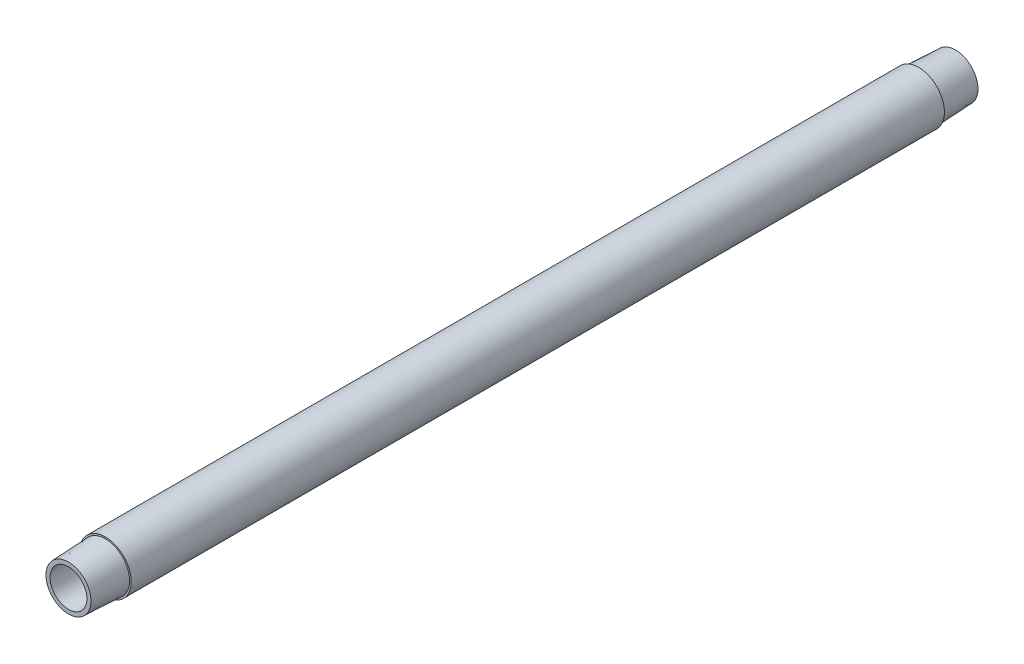
ISO-10303-21;
HEADER;
FILE_DESCRIPTION(('STEP AP214'),'2;1');
FILE_NAME('part.step','',(''),(''),'','','');
FILE_SCHEMA(('AUTOMOTIVE_DESIGN { 1 0 10303 214 1 1 1 1 }'));
ENDSEC;
DATA;
#1=APPLICATION_CONTEXT('core data for automotive mechanical design processes');
#2=APPLICATION_PROTOCOL_DEFINITION('international standard','automotive_design',2000,#1);
#3=PRODUCT_CONTEXT('',#1,'mechanical');
#4=PRODUCT('Part','Part','',(#3));
#5=PRODUCT_RELATED_PRODUCT_CATEGORY('part','',(#4));
#6=PRODUCT_DEFINITION_FORMATION('','',#4);
#7=PRODUCT_DEFINITION_CONTEXT('part definition',#1,'design');
#8=PRODUCT_DEFINITION('design','',#6,#7);
#9=PRODUCT_DEFINITION_SHAPE('','',#8);
#10=(LENGTH_UNIT() NAMED_UNIT(*) SI_UNIT(.MILLI.,.METRE.));
#11=(NAMED_UNIT(*) PLANE_ANGLE_UNIT() SI_UNIT($,.RADIAN.));
#12=(NAMED_UNIT(*) SI_UNIT($,.STERADIAN.) SOLID_ANGLE_UNIT());
#13=UNCERTAINTY_MEASURE_WITH_UNIT(LENGTH_MEASURE(1.E-05),#10,'distance_accuracy_value','');
#14=(GEOMETRIC_REPRESENTATION_CONTEXT(3) GLOBAL_UNCERTAINTY_ASSIGNED_CONTEXT((#13)) GLOBAL_UNIT_ASSIGNED_CONTEXT((#10,
#11,#12)) REPRESENTATION_CONTEXT('',''));
#15=CARTESIAN_POINT('',(0.,0.,0.));
#16=DIRECTION('',(0.,0.,1.));
#17=DIRECTION('',(1.,0.,0.));
#18=AXIS2_PLACEMENT_3D('',#15,#16,#17);
#19=CARTESIAN_POINT('',(0.,0.,457.2));
#20=DIRECTION('',(0.,0.,-1.));
#21=DIRECTION('',(-1.,0.,0.));
#22=AXIS2_PLACEMENT_3D('',#19,#20,#21);
#23=CYLINDRICAL_SURFACE('',#22,13.335);
#24=CARTESIAN_POINT('',(0.,0.,19.0074323177782));
#25=DIRECTION('',(0.,0.,-1.));
#26=DIRECTION('',(-1.,0.,0.));
#27=AXIS2_PLACEMENT_3D('',#24,#25,#26);
#28=CIRCLE('',#27,13.335);
#29=CARTESIAN_POINT('',(-13.335,0.,19.0074323177782));
#30=VERTEX_POINT('',#29);
#31=EDGE_CURVE('E43',#30,#30,#28,.T.);
#32=ORIENTED_EDGE('',*,*,#31,.F.);
#33=EDGE_LOOP('',(#32));
#34=FACE_BOUND('',#33,.T.);
#35=CARTESIAN_POINT('',(0.,0.,438.192567682222));
#36=DIRECTION('',(0.,0.,1.));
#37=DIRECTION('',(1.,0.,0.));
#38=AXIS2_PLACEMENT_3D('',#35,#36,#37);
#39=CIRCLE('',#38,13.335);
#40=CARTESIAN_POINT('',(13.335,0.,438.192567682222));
#41=VERTEX_POINT('',#40);
#42=EDGE_CURVE('E34',#41,#41,#39,.T.);
#43=ORIENTED_EDGE('',*,*,#42,.F.);
#44=EDGE_LOOP('',(#43));
#45=FACE_BOUND('',#44,.T.);
#46=ADVANCED_FACE('F31',(#34,#45),#23,.T.);
#47=CARTESIAN_POINT('',(0.,0.,457.2));
#48=DIRECTION('',(0.,0.,1.));
#49=DIRECTION('',(1.,0.,0.));
#50=AXIS2_PLACEMENT_3D('',#47,#48,#49);
#51=PLANE('',#50);
#52=CARTESIAN_POINT('',(0.,0.,457.2));
#53=DIRECTION('',(0.,0.,1.));
#54=DIRECTION('',(1.,0.,0.));
#55=AXIS2_PLACEMENT_3D('',#52,#53,#54);
#56=CIRCLE('',#55,9.525);
#57=CARTESIAN_POINT('',(9.525,0.,457.2));
#58=VERTEX_POINT('',#57);
#59=EDGE_CURVE('E10',#58,#58,#56,.T.);
#60=ORIENTED_EDGE('',*,*,#59,.F.);
#61=EDGE_LOOP('',(#60));
#62=FACE_BOUND('',#61,.T.);
#63=CARTESIAN_POINT('',(0.,0.,457.2));
#64=DIRECTION('',(0.,0.,1.));
#65=DIRECTION('',(1.,0.,0.));
#66=AXIS2_PLACEMENT_3D('',#63,#64,#65);
#67=CIRCLE('',#66,11.6045319186355);
#68=CARTESIAN_POINT('',(11.6045319186355,0.,457.2));
#69=VERTEX_POINT('',#68);
#70=EDGE_CURVE('E59',#69,#69,#67,.T.);
#71=ORIENTED_EDGE('',*,*,#70,.T.);
#72=EDGE_LOOP('',(#71));
#73=FACE_BOUND('',#72,.T.);
#74=ADVANCED_FACE('F78',(#62,#73),#51,.T.);
#75=CARTESIAN_POINT('',(0.,0.,0.));
#76=DIRECTION('',(0.,0.,1.));
#77=DIRECTION('',(1.,0.,0.));
#78=AXIS2_PLACEMENT_3D('',#75,#76,#77);
#79=PLANE('',#78);
#80=CARTESIAN_POINT('',(0.,0.,0.));
#81=DIRECTION('',(0.,0.,1.));
#82=DIRECTION('',(1.,0.,0.));
#83=AXIS2_PLACEMENT_3D('',#80,#81,#82);
#84=CIRCLE('',#83,9.525);
#85=CARTESIAN_POINT('',(9.525,0.,0.));
#86=VERTEX_POINT('',#85);
#87=EDGE_CURVE('E38',#86,#86,#84,.T.);
#88=ORIENTED_EDGE('',*,*,#87,.T.);
#89=EDGE_LOOP('',(#88));
#90=FACE_BOUND('',#89,.T.);
#91=CARTESIAN_POINT('',(0.,0.,0.));
#92=DIRECTION('',(0.,0.,1.));
#93=DIRECTION('',(1.,0.,0.));
#94=AXIS2_PLACEMENT_3D('',#91,#92,#93);
#95=CIRCLE('',#94,11.6045319186355);
#96=CARTESIAN_POINT('',(11.6045319186355,0.,0.));
#97=VERTEX_POINT('',#96);
#98=EDGE_CURVE('E46',#97,#97,#95,.T.);
#99=ORIENTED_EDGE('',*,*,#98,.F.);
#100=EDGE_LOOP('',(#99));
#101=FACE_BOUND('',#100,.T.);
#102=ADVANCED_FACE('F83',(#90,#101),#79,.F.);
#103=CARTESIAN_POINT('',(0.,0.,457.2));
#104=DIRECTION('',(0.,0.,-1.));
#105=DIRECTION('',(-1.,0.,0.));
#106=AXIS2_PLACEMENT_3D('',#103,#104,#105);
#107=CYLINDRICAL_SURFACE('',#106,9.525);
#108=ORIENTED_EDGE('',*,*,#59,.T.);
#109=EDGE_LOOP('',(#108));
#110=FACE_BOUND('',#109,.T.);
#111=ORIENTED_EDGE('',*,*,#87,.F.);
#112=EDGE_LOOP('',(#111));
#113=FACE_BOUND('',#112,.T.);
#114=ADVANCED_FACE('F89',(#110,#113),#107,.F.);
#115=CARTESIAN_POINT('',(0.,12.4872010595709,19.0074323177782));
#116=DIRECTION('',(0.,0.,-1.));
#117=DIRECTION('',(-1.,0.,0.));
#118=AXIS2_PLACEMENT_3D('',#115,#116,#117);
#119=PLANE('',#118);
#120=CARTESIAN_POINT('',(0.,0.,19.0074323177782));
#121=DIRECTION('',(0.,0.,1.));
#122=DIRECTION('',(1.,0.,0.));
#123=AXIS2_PLACEMENT_3D('',#120,#121,#122);
#124=CIRCLE('',#123,12.4872010595709);
#125=CARTESIAN_POINT('',(12.4872010595709,0.,19.0074323177782));
#126=VERTEX_POINT('',#125);
#127=EDGE_CURVE('E52',#126,#126,#124,.T.);
#128=ORIENTED_EDGE('',*,*,#127,.T.);
#129=EDGE_LOOP('',(#128));
#130=FACE_BOUND('',#129,.T.);
#131=ORIENTED_EDGE('',*,*,#31,.T.);
#132=EDGE_LOOP('',(#131));
#133=FACE_BOUND('',#132,.T.);
#134=ADVANCED_FACE('F95',(#130,#133),#119,.T.);
#135=CARTESIAN_POINT('',(0.,0.,19.0074323177782));
#136=DIRECTION('',(0.,0.,1.));
#137=DIRECTION('',(1.,0.,0.));
#138=AXIS2_PLACEMENT_3D('',#135,#136,#137);
#139=CONICAL_SURFACE('',#138,12.4872010595709,0.0464047670719432);
#140=ORIENTED_EDGE('',*,*,#98,.T.);
#141=EDGE_LOOP('',(#140));
#142=FACE_BOUND('',#141,.T.);
#143=ORIENTED_EDGE('',*,*,#127,.F.);
#144=EDGE_LOOP('',(#143));
#145=FACE_BOUND('',#144,.T.);
#146=ADVANCED_FACE('F73',(#142,#145),#139,.T.);
#147=CARTESIAN_POINT('',(0.,12.4872010595709,438.192567682222));
#148=DIRECTION('',(0.,0.,1.));
#149=DIRECTION('',(1.,0.,0.));
#150=AXIS2_PLACEMENT_3D('',#147,#148,#149);
#151=PLANE('',#150);
#152=CARTESIAN_POINT('',(0.,0.,438.192567682222));
#153=DIRECTION('',(0.,0.,1.));
#154=DIRECTION('',(1.,0.,0.));
#155=AXIS2_PLACEMENT_3D('',#152,#153,#154);
#156=CIRCLE('',#155,12.4872010595709);
#157=CARTESIAN_POINT('',(12.4872010595709,0.,438.192567682222));
#158=VERTEX_POINT('',#157);
#159=EDGE_CURVE('E63',#158,#158,#156,.T.);
#160=ORIENTED_EDGE('',*,*,#159,.F.);
#161=EDGE_LOOP('',(#160));
#162=FACE_BOUND('',#161,.T.);
#163=ORIENTED_EDGE('',*,*,#42,.T.);
#164=EDGE_LOOP('',(#163));
#165=FACE_BOUND('',#164,.T.);
#166=ADVANCED_FACE('F70',(#162,#165),#151,.T.);
#167=CARTESIAN_POINT('',(0.,0.,457.2));
#168=DIRECTION('',(0.,0.,-1.));
#169=DIRECTION('',(-1.,0.,0.));
#170=AXIS2_PLACEMENT_3D('',#167,#168,#169);
#171=CONICAL_SURFACE('',#170,11.6045319186355,0.0464047670719432);
#172=ORIENTED_EDGE('',*,*,#159,.T.);
#173=EDGE_LOOP('',(#172));
#174=FACE_BOUND('',#173,.T.);
#175=ORIENTED_EDGE('',*,*,#70,.F.);
#176=EDGE_LOOP('',(#175));
#177=FACE_BOUND('',#176,.T.);
#178=ADVANCED_FACE('F67',(#174,#177),#171,.T.);
#179=CLOSED_SHELL('',(#46,#74,#102,#114,#134,#146,#166,#178));
#180=MANIFOLD_SOLID_BREP('B2',#179);
#181=ADVANCED_BREP_SHAPE_REPRESENTATION('',(#18,#180),#14);
#182=SHAPE_DEFINITION_REPRESENTATION(#9,#181);
ENDSEC;
END-ISO-10303-21;
